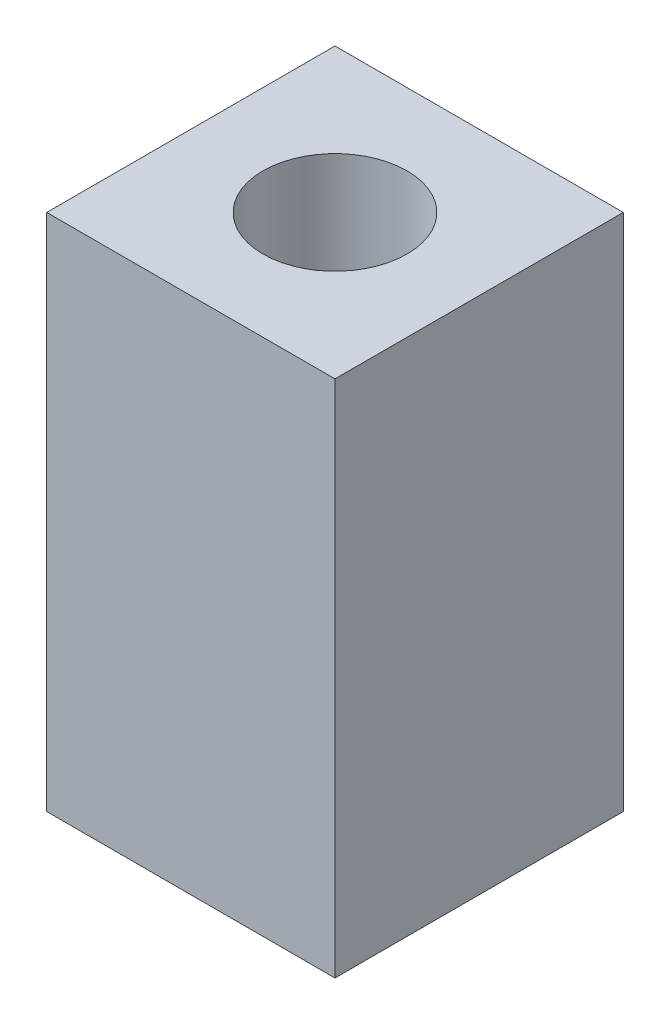
ISO-10303-21;
HEADER;
FILE_DESCRIPTION(('STEP AP214'),'2;1');
FILE_NAME('part.step','',(''),(''),'','','');
FILE_SCHEMA(('AUTOMOTIVE_DESIGN { 1 0 10303 214 1 1 1 1 }'));
ENDSEC;
DATA;
#1=APPLICATION_CONTEXT('core data for automotive mechanical design processes');
#2=APPLICATION_PROTOCOL_DEFINITION('international standard','automotive_design',2000,#1);
#3=PRODUCT_CONTEXT('',#1,'mechanical');
#4=PRODUCT('Part','Part','',(#3));
#5=PRODUCT_RELATED_PRODUCT_CATEGORY('part','',(#4));
#6=PRODUCT_DEFINITION_FORMATION('','',#4);
#7=PRODUCT_DEFINITION_CONTEXT('part definition',#1,'design');
#8=PRODUCT_DEFINITION('design','',#6,#7);
#9=PRODUCT_DEFINITION_SHAPE('','',#8);
#10=(LENGTH_UNIT() NAMED_UNIT(*) SI_UNIT(.MILLI.,.METRE.));
#11=(NAMED_UNIT(*) PLANE_ANGLE_UNIT() SI_UNIT($,.RADIAN.));
#12=(NAMED_UNIT(*) SI_UNIT($,.STERADIAN.) SOLID_ANGLE_UNIT());
#13=UNCERTAINTY_MEASURE_WITH_UNIT(LENGTH_MEASURE(1.E-05),#10,'distance_accuracy_value','');
#14=(GEOMETRIC_REPRESENTATION_CONTEXT(3) GLOBAL_UNCERTAINTY_ASSIGNED_CONTEXT((#13)) GLOBAL_UNIT_ASSIGNED_CONTEXT((#10,
#11,#12)) REPRESENTATION_CONTEXT('',''));
#15=CARTESIAN_POINT('',(0.,0.,0.));
#16=DIRECTION('',(0.,0.,1.));
#17=DIRECTION('',(1.,0.,0.));
#18=AXIS2_PLACEMENT_3D('',#15,#16,#17);
#19=CARTESIAN_POINT('',(0.,10.8,0.));
#20=DIRECTION('',(0.,1.,0.));
#21=DIRECTION('',(0.,0.,1.));
#22=AXIS2_PLACEMENT_3D('',#19,#20,#21);
#23=PLANE('',#22);
#24=DIRECTION('',(0.,0.,-1.));
#25=VECTOR('',#24,1.);
#26=CARTESIAN_POINT('',(3.,10.8,-3.));
#27=LINE('',#26,#25);
#28=CARTESIAN_POINT('',(3.,10.8,3.));
#29=VERTEX_POINT('',#28);
#30=CARTESIAN_POINT('',(3.,10.8,-3.));
#31=VERTEX_POINT('',#30);
#32=EDGE_CURVE('E88',#29,#31,#27,.T.);
#33=ORIENTED_EDGE('',*,*,#32,.T.);
#34=DIRECTION('',(-1.,0.,0.));
#35=VECTOR('',#34,1.);
#36=CARTESIAN_POINT('',(-3.,10.8,-3.));
#37=LINE('',#36,#35);
#38=CARTESIAN_POINT('',(-3.,10.8,-3.));
#39=VERTEX_POINT('',#38);
#40=EDGE_CURVE('E83',#31,#39,#37,.T.);
#41=ORIENTED_EDGE('',*,*,#40,.T.);
#42=DIRECTION('',(0.,0.,1.));
#43=VECTOR('',#42,1.);
#44=CARTESIAN_POINT('',(-3.,10.8,-3.));
#45=LINE('',#44,#43);
#46=CARTESIAN_POINT('',(-3.,10.8,3.));
#47=VERTEX_POINT('',#46);
#48=EDGE_CURVE('E86',#39,#47,#45,.T.);
#49=ORIENTED_EDGE('',*,*,#48,.T.);
#50=DIRECTION('',(1.,0.,0.));
#51=VECTOR('',#50,1.);
#52=CARTESIAN_POINT('',(-3.,10.8,3.));
#53=LINE('',#52,#51);
#54=EDGE_CURVE('E53',#47,#29,#53,.T.);
#55=ORIENTED_EDGE('',*,*,#54,.T.);
#56=EDGE_LOOP('',(#33,#41,#49,#55));
#57=FACE_BOUND('',#56,.T.);
#58=CARTESIAN_POINT('',(0.,10.8,0.));
#59=DIRECTION('',(0.,1.,0.));
#60=DIRECTION('',(0.,0.,1.));
#61=AXIS2_PLACEMENT_3D('',#58,#59,#60);
#62=CIRCLE('',#61,1.5);
#63=CARTESIAN_POINT('',(0.,10.8,-1.5));
#64=VERTEX_POINT('',#63);
#65=EDGE_CURVE('E103',#64,#64,#62,.T.);
#66=ORIENTED_EDGE('',*,*,#65,.F.);
#67=EDGE_LOOP('',(#66));
#68=FACE_BOUND('',#67,.T.);
#69=ADVANCED_FACE('F36',(#57,#68),#23,.T.);
#70=CARTESIAN_POINT('',(0.,0.,0.));
#71=DIRECTION('',(0.,1.,0.));
#72=DIRECTION('',(0.,0.,1.));
#73=AXIS2_PLACEMENT_3D('',#70,#71,#72);
#74=PLANE('',#73);
#75=DIRECTION('',(0.,0.,-1.));
#76=VECTOR('',#75,1.);
#77=CARTESIAN_POINT('',(3.,0.,-3.));
#78=LINE('',#77,#76);
#79=CARTESIAN_POINT('',(3.,0.,3.));
#80=VERTEX_POINT('',#79);
#81=CARTESIAN_POINT('',(3.,0.,-3.));
#82=VERTEX_POINT('',#81);
#83=EDGE_CURVE('E100',#80,#82,#78,.T.);
#84=ORIENTED_EDGE('',*,*,#83,.F.);
#85=DIRECTION('',(1.,0.,0.));
#86=VECTOR('',#85,1.);
#87=CARTESIAN_POINT('',(-3.,0.,3.));
#88=LINE('',#87,#86);
#89=CARTESIAN_POINT('',(-3.,0.,3.));
#90=VERTEX_POINT('',#89);
#91=EDGE_CURVE('E76',#90,#80,#88,.T.);
#92=ORIENTED_EDGE('',*,*,#91,.F.);
#93=DIRECTION('',(0.,0.,1.));
#94=VECTOR('',#93,1.);
#95=CARTESIAN_POINT('',(-3.,0.,-3.));
#96=LINE('',#95,#94);
#97=CARTESIAN_POINT('',(-3.,0.,-3.));
#98=VERTEX_POINT('',#97);
#99=EDGE_CURVE('E70',#98,#90,#96,.T.);
#100=ORIENTED_EDGE('',*,*,#99,.F.);
#101=DIRECTION('',(-1.,0.,0.));
#102=VECTOR('',#101,1.);
#103=CARTESIAN_POINT('',(-3.,0.,-3.));
#104=LINE('',#103,#102);
#105=EDGE_CURVE('E92',#82,#98,#104,.T.);
#106=ORIENTED_EDGE('',*,*,#105,.F.);
#107=EDGE_LOOP('',(#84,#92,#100,#106));
#108=FACE_BOUND('',#107,.T.);
#109=CARTESIAN_POINT('',(0.,0.,0.));
#110=DIRECTION('',(0.,1.,0.));
#111=DIRECTION('',(0.,0.,1.));
#112=AXIS2_PLACEMENT_3D('',#109,#110,#111);
#113=CIRCLE('',#112,1.5);
#114=CARTESIAN_POINT('',(0.,0.,-1.5));
#115=VERTEX_POINT('',#114);
#116=EDGE_CURVE('E115',#115,#115,#113,.T.);
#117=ORIENTED_EDGE('',*,*,#116,.T.);
#118=EDGE_LOOP('',(#117));
#119=FACE_BOUND('',#118,.T.);
#120=ADVANCED_FACE('F111',(#108,#119),#74,.F.);
#121=CARTESIAN_POINT('',(3.,10.8,-3.));
#122=DIRECTION('',(-1.,0.,0.));
#123=DIRECTION('',(0.,0.,1.));
#124=AXIS2_PLACEMENT_3D('',#121,#122,#123);
#125=PLANE('',#124);
#126=ORIENTED_EDGE('',*,*,#83,.T.);
#127=DIRECTION('',(0.,-1.,0.));
#128=VECTOR('',#127,1.);
#129=CARTESIAN_POINT('',(3.,10.8,-3.));
#130=LINE('',#129,#128);
#131=EDGE_CURVE('E11',#31,#82,#130,.T.);
#132=ORIENTED_EDGE('',*,*,#131,.F.);
#133=ORIENTED_EDGE('',*,*,#32,.F.);
#134=DIRECTION('',(0.,-1.,0.));
#135=VECTOR('',#134,1.);
#136=CARTESIAN_POINT('',(3.,10.8,3.));
#137=LINE('',#136,#135);
#138=EDGE_CURVE('E96',#29,#80,#137,.T.);
#139=ORIENTED_EDGE('',*,*,#138,.T.);
#140=EDGE_LOOP('',(#126,#132,#133,#139));
#141=FACE_BOUND('',#140,.T.);
#142=ADVANCED_FACE('F38',(#141),#125,.F.);
#143=CARTESIAN_POINT('',(-3.,10.8,-3.));
#144=DIRECTION('',(0.,0.,1.));
#145=DIRECTION('',(1.,0.,0.));
#146=AXIS2_PLACEMENT_3D('',#143,#144,#145);
#147=PLANE('',#146);
#148=ORIENTED_EDGE('',*,*,#105,.T.);
#149=DIRECTION('',(0.,-1.,0.));
#150=VECTOR('',#149,1.);
#151=CARTESIAN_POINT('',(-3.,10.8,-3.));
#152=LINE('',#151,#150);
#153=EDGE_CURVE('E45',#39,#98,#152,.T.);
#154=ORIENTED_EDGE('',*,*,#153,.F.);
#155=ORIENTED_EDGE('',*,*,#40,.F.);
#156=ORIENTED_EDGE('',*,*,#131,.T.);
#157=EDGE_LOOP('',(#148,#154,#155,#156));
#158=FACE_BOUND('',#157,.T.);
#159=ADVANCED_FACE('F91',(#158),#147,.F.);
#160=CARTESIAN_POINT('',(-3.,10.8,-3.));
#161=DIRECTION('',(1.,0.,0.));
#162=DIRECTION('',(0.,0.,-1.));
#163=AXIS2_PLACEMENT_3D('',#160,#161,#162);
#164=PLANE('',#163);
#165=ORIENTED_EDGE('',*,*,#99,.T.);
#166=DIRECTION('',(0.,-1.,0.));
#167=VECTOR('',#166,1.);
#168=CARTESIAN_POINT('',(-3.,10.8,3.));
#169=LINE('',#168,#167);
#170=EDGE_CURVE('E93',#47,#90,#169,.T.);
#171=ORIENTED_EDGE('',*,*,#170,.F.);
#172=ORIENTED_EDGE('',*,*,#48,.F.);
#173=ORIENTED_EDGE('',*,*,#153,.T.);
#174=EDGE_LOOP('',(#165,#171,#172,#173));
#175=FACE_BOUND('',#174,.T.);
#176=ADVANCED_FACE('F94',(#175),#164,.F.);
#177=CARTESIAN_POINT('',(-3.,10.8,3.));
#178=DIRECTION('',(0.,0.,-1.));
#179=DIRECTION('',(-1.,0.,0.));
#180=AXIS2_PLACEMENT_3D('',#177,#178,#179);
#181=PLANE('',#180);
#182=ORIENTED_EDGE('',*,*,#91,.T.);
#183=ORIENTED_EDGE('',*,*,#138,.F.);
#184=ORIENTED_EDGE('',*,*,#54,.F.);
#185=ORIENTED_EDGE('',*,*,#170,.T.);
#186=EDGE_LOOP('',(#182,#183,#184,#185));
#187=FACE_BOUND('',#186,.T.);
#188=ADVANCED_FACE('F108',(#187),#181,.F.);
#189=CARTESIAN_POINT('',(0.,10.8,0.));
#190=DIRECTION('',(0.,-1.,0.));
#191=DIRECTION('',(0.,0.,-1.));
#192=AXIS2_PLACEMENT_3D('',#189,#190,#191);
#193=CYLINDRICAL_SURFACE('',#192,1.5);
#194=CARTESIAN_POINT('',(0.,10.8,-1.5));
#195=CARTESIAN_POINT('',(0.,10.6875,-1.5));
#196=CARTESIAN_POINT('',(0.,10.575,-1.5));
#197=CARTESIAN_POINT('',(0.,10.35,-1.5));
#198=CARTESIAN_POINT('',(0.,10.2375,-1.5));
#199=CARTESIAN_POINT('',(0.,10.0125,-1.5));
#200=CARTESIAN_POINT('',(0.,9.9,-1.5));
#201=CARTESIAN_POINT('',(0.,9.675,-1.5));
#202=CARTESIAN_POINT('',(0.,9.5625,-1.5));
#203=CARTESIAN_POINT('',(0.,9.3375,-1.5));
#204=CARTESIAN_POINT('',(0.,9.225,-1.5));
#205=CARTESIAN_POINT('',(0.,9.,-1.5));
#206=CARTESIAN_POINT('',(0.,8.8875,-1.5));
#207=CARTESIAN_POINT('',(0.,8.6625,-1.5));
#208=CARTESIAN_POINT('',(0.,8.55,-1.5));
#209=CARTESIAN_POINT('',(0.,8.325,-1.5));
#210=CARTESIAN_POINT('',(0.,8.2125,-1.5));
#211=CARTESIAN_POINT('',(0.,7.9875,-1.5));
#212=CARTESIAN_POINT('',(0.,7.875,-1.5));
#213=CARTESIAN_POINT('',(0.,7.65,-1.5));
#214=CARTESIAN_POINT('',(0.,7.5375,-1.5));
#215=CARTESIAN_POINT('',(0.,7.3125,-1.5));
#216=CARTESIAN_POINT('',(0.,7.2,-1.5));
#217=CARTESIAN_POINT('',(0.,6.975,-1.5));
#218=CARTESIAN_POINT('',(0.,6.8625,-1.5));
#219=CARTESIAN_POINT('',(0.,6.6375,-1.5));
#220=CARTESIAN_POINT('',(0.,6.525,-1.5));
#221=CARTESIAN_POINT('',(0.,6.3,-1.5));
#222=CARTESIAN_POINT('',(0.,6.1875,-1.5));
#223=CARTESIAN_POINT('',(0.,5.9625,-1.5));
#224=CARTESIAN_POINT('',(0.,5.85,-1.5));
#225=CARTESIAN_POINT('',(0.,5.625,-1.5));
#226=CARTESIAN_POINT('',(0.,5.5125,-1.5));
#227=CARTESIAN_POINT('',(0.,5.2875,-1.5));
#228=CARTESIAN_POINT('',(0.,5.175,-1.5));
#229=CARTESIAN_POINT('',(0.,4.95,-1.5));
#230=CARTESIAN_POINT('',(0.,4.8375,-1.5));
#231=CARTESIAN_POINT('',(0.,4.6125,-1.5));
#232=CARTESIAN_POINT('',(0.,4.5,-1.5));
#233=CARTESIAN_POINT('',(0.,4.275,-1.5));
#234=CARTESIAN_POINT('',(0.,4.1625,-1.5));
#235=CARTESIAN_POINT('',(0.,3.9375,-1.5));
#236=CARTESIAN_POINT('',(0.,3.825,-1.5));
#237=CARTESIAN_POINT('',(0.,3.6,-1.5));
#238=CARTESIAN_POINT('',(0.,3.4875,-1.5));
#239=CARTESIAN_POINT('',(0.,3.2625,-1.5));
#240=CARTESIAN_POINT('',(0.,3.15,-1.5));
#241=CARTESIAN_POINT('',(0.,2.925,-1.5));
#242=CARTESIAN_POINT('',(0.,2.8125,-1.5));
#243=CARTESIAN_POINT('',(0.,2.5875,-1.5));
#244=CARTESIAN_POINT('',(0.,2.475,-1.5));
#245=CARTESIAN_POINT('',(0.,2.25,-1.5));
#246=CARTESIAN_POINT('',(0.,2.1375,-1.5));
#247=CARTESIAN_POINT('',(0.,1.9125,-1.5));
#248=CARTESIAN_POINT('',(0.,1.8,-1.5));
#249=CARTESIAN_POINT('',(0.,1.575,-1.5));
#250=CARTESIAN_POINT('',(0.,1.4625,-1.5));
#251=CARTESIAN_POINT('',(0.,1.2375,-1.5));
#252=CARTESIAN_POINT('',(0.,1.125,-1.5));
#253=CARTESIAN_POINT('',(0.,0.899999999999998,-1.5));
#254=CARTESIAN_POINT('',(0.,0.787499999999998,-1.5));
#255=CARTESIAN_POINT('',(0.,0.562499999999998,-1.5));
#256=CARTESIAN_POINT('',(0.,0.449999999999998,-1.5));
#257=CARTESIAN_POINT('',(0.,0.224999999999998,-1.5));
#258=CARTESIAN_POINT('',(0.,0.112499999999998,-1.5));
#259=CARTESIAN_POINT('',(0.,0.,-1.5));
#260=B_SPLINE_CURVE_WITH_KNOTS('',3,(#194,#195,#196,#197,#198,#199,#200,#201,#202,#203,#204,
#205,#206,#207,#208,#209,#210,#211,#212,#213,#214,#215,#216,#217,#218,#219,#220,#221,#222,#223,
#224,#225,#226,#227,#228,#229,#230,#231,#232,#233,#234,#235,#236,#237,#238,#239,#240,#241,#242,
#243,#244,#245,#246,#247,#248,#249,#250,#251,#252,#253,#254,#255,#256,#257,#258,#259),
.UNSPECIFIED.,.F.,.F.,(4,2,2,2,2,2,2,2,2,2,2,2,2,2,2,2,2,2,2,2,2,2,2,2,2,2,2,2,2,2,2,2,4),(0.,
0.337499999999999,0.674999999999998,1.0125,1.35,1.6875,2.025,2.3625,2.7,3.0375,3.375,3.7125,
4.05,4.3875,4.725,5.0625,5.4,5.7375,6.075,6.4125,6.75,7.0875,7.425,7.7625,8.1,8.4375,8.775,
9.1125,9.45,9.7875,10.125,10.4625,10.8),.UNSPECIFIED.);
#261=EDGE_CURVE('BSEAM121',#64,#115,#260,.T.);
#262=ORIENTED_EDGE('',*,*,#65,.T.);
#263=ORIENTED_EDGE('',*,*,#116,.F.);
#264=ORIENTED_EDGE('',*,*,#261,.T.);
#265=ORIENTED_EDGE('',*,*,#261,.F.);
#266=EDGE_LOOP('',(#262,#264,#263,#265));
#267=FACE_BOUND('',#266,.T.);
#268=ADVANCED_FACE('F121',(#267),#193,.F.);
#269=CLOSED_SHELL('',(#69,#120,#142,#159,#176,#188,#268));
#270=MANIFOLD_SOLID_BREP('B2',#269);
#271=ADVANCED_BREP_SHAPE_REPRESENTATION('',(#18,#270),#14);
#272=SHAPE_DEFINITION_REPRESENTATION(#9,#271);
ENDSEC;
END-ISO-10303-21;
